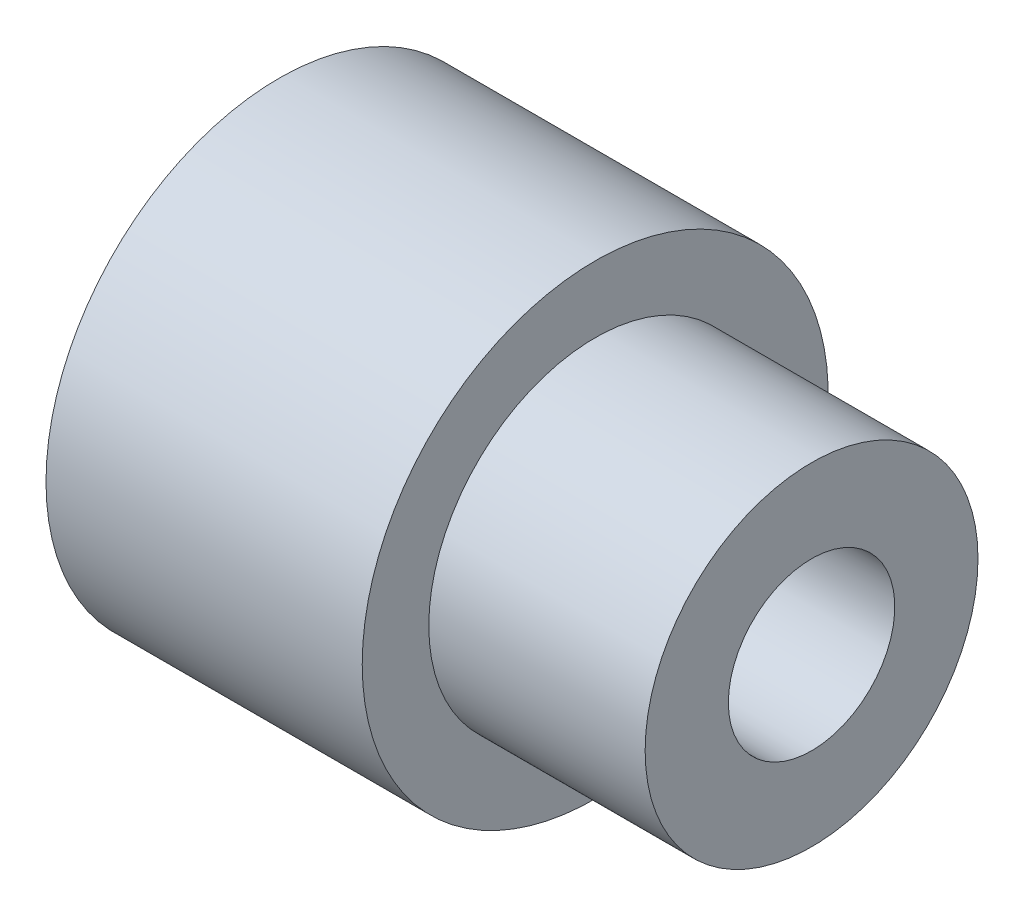
ISO-10303-21;
HEADER;
FILE_DESCRIPTION(('STEP AP214'),'2;1');
FILE_NAME('part.step','',(''),(''),'','','');
FILE_SCHEMA(('AUTOMOTIVE_DESIGN { 1 0 10303 214 1 1 1 1 }'));
ENDSEC;
DATA;
#1=APPLICATION_CONTEXT('core data for automotive mechanical design processes');
#2=APPLICATION_PROTOCOL_DEFINITION('international standard','automotive_design',2000,#1);
#3=PRODUCT_CONTEXT('',#1,'mechanical');
#4=PRODUCT('Part','Part','',(#3));
#5=PRODUCT_RELATED_PRODUCT_CATEGORY('part','',(#4));
#6=PRODUCT_DEFINITION_FORMATION('','',#4);
#7=PRODUCT_DEFINITION_CONTEXT('part definition',#1,'design');
#8=PRODUCT_DEFINITION('design','',#6,#7);
#9=PRODUCT_DEFINITION_SHAPE('','',#8);
#10=(LENGTH_UNIT() NAMED_UNIT(*) SI_UNIT(.MILLI.,.METRE.));
#11=(NAMED_UNIT(*) PLANE_ANGLE_UNIT() SI_UNIT($,.RADIAN.));
#12=(NAMED_UNIT(*) SI_UNIT($,.STERADIAN.) SOLID_ANGLE_UNIT());
#13=UNCERTAINTY_MEASURE_WITH_UNIT(LENGTH_MEASURE(1.E-05),#10,'distance_accuracy_value','');
#14=(GEOMETRIC_REPRESENTATION_CONTEXT(3) GLOBAL_UNCERTAINTY_ASSIGNED_CONTEXT((#13)) GLOBAL_UNIT_ASSIGNED_CONTEXT((#10,
#11,#12)) REPRESENTATION_CONTEXT('',''));
#15=CARTESIAN_POINT('',(0.,0.,0.));
#16=DIRECTION('',(0.,0.,1.));
#17=DIRECTION('',(1.,0.,0.));
#18=AXIS2_PLACEMENT_3D('',#15,#16,#17);
#19=CARTESIAN_POINT('',(-24.6125870642381,0.,0.));
#20=DIRECTION('',(-1.,0.,0.));
#21=DIRECTION('',(0.,0.,1.));
#22=AXIS2_PLACEMENT_3D('',#19,#20,#21);
#23=CYLINDRICAL_SURFACE('',#22,11.);
#24=CARTESIAN_POINT('',(-10.,0.,0.));
#25=DIRECTION('',(-1.,0.,0.));
#26=DIRECTION('',(0.,0.,1.));
#27=AXIS2_PLACEMENT_3D('',#24,#25,#26);
#28=CIRCLE('',#27,11.);
#29=CARTESIAN_POINT('',(-10.,0.,11.));
#30=VERTEX_POINT('',#29);
#31=EDGE_CURVE('E83',#30,#30,#28,.T.);
#32=ORIENTED_EDGE('',*,*,#31,.F.);
#33=EDGE_LOOP('',(#32));
#34=FACE_BOUND('',#33,.T.);
#35=CARTESIAN_POINT('',(-16.,0.,0.));
#36=DIRECTION('',(-1.,0.,0.));
#37=DIRECTION('',(0.,0.,1.));
#38=AXIS2_PLACEMENT_3D('',#35,#36,#37);
#39=CIRCLE('',#38,11.);
#40=CARTESIAN_POINT('',(-16.,0.,11.));
#41=VERTEX_POINT('',#40);
#42=EDGE_CURVE('E10',#41,#41,#39,.T.);
#43=ORIENTED_EDGE('',*,*,#42,.T.);
#44=EDGE_LOOP('',(#43));
#45=FACE_BOUND('',#44,.T.);
#46=ADVANCED_FACE('F40',(#34,#45),#23,.F.);
#47=CARTESIAN_POINT('',(-16.,11.,0.));
#48=DIRECTION('',(1.,0.,0.));
#49=DIRECTION('',(0.,0.,-1.));
#50=AXIS2_PLACEMENT_3D('',#47,#48,#49);
#51=PLANE('',#50);
#52=ORIENTED_EDGE('',*,*,#42,.F.);
#53=EDGE_LOOP('',(#52));
#54=FACE_BOUND('',#53,.T.);
#55=CARTESIAN_POINT('',(-16.,0.,0.));
#56=DIRECTION('',(-1.,0.,0.));
#57=DIRECTION('',(0.,0.,1.));
#58=AXIS2_PLACEMENT_3D('',#55,#56,#57);
#59=CIRCLE('',#58,14.);
#60=CARTESIAN_POINT('',(-16.,0.,14.));
#61=VERTEX_POINT('',#60);
#62=EDGE_CURVE('E47',#61,#61,#59,.T.);
#63=ORIENTED_EDGE('',*,*,#62,.T.);
#64=EDGE_LOOP('',(#63));
#65=FACE_BOUND('',#64,.T.);
#66=ADVANCED_FACE('F91',(#54,#65),#51,.F.);
#67=CARTESIAN_POINT('',(-24.6125870642381,0.,0.));
#68=DIRECTION('',(-1.,0.,0.));
#69=DIRECTION('',(0.,0.,1.));
#70=AXIS2_PLACEMENT_3D('',#67,#68,#69);
#71=CYLINDRICAL_SURFACE('',#70,14.);
#72=ORIENTED_EDGE('',*,*,#62,.F.);
#73=EDGE_LOOP('',(#72));
#74=FACE_BOUND('',#73,.T.);
#75=CARTESIAN_POINT('',(3.,0.,0.));
#76=DIRECTION('',(-1.,0.,0.));
#77=DIRECTION('',(0.,0.,1.));
#78=AXIS2_PLACEMENT_3D('',#75,#76,#77);
#79=CIRCLE('',#78,14.);
#80=CARTESIAN_POINT('',(3.,0.,14.));
#81=VERTEX_POINT('',#80);
#82=EDGE_CURVE('E52',#81,#81,#79,.T.);
#83=ORIENTED_EDGE('',*,*,#82,.T.);
#84=EDGE_LOOP('',(#83));
#85=FACE_BOUND('',#84,.T.);
#86=ADVANCED_FACE('F95',(#74,#85),#71,.T.);
#87=CARTESIAN_POINT('',(3.,14.,0.));
#88=DIRECTION('',(-1.,0.,0.));
#89=DIRECTION('',(0.,0.,1.));
#90=AXIS2_PLACEMENT_3D('',#87,#88,#89);
#91=PLANE('',#90);
#92=ORIENTED_EDGE('',*,*,#82,.F.);
#93=EDGE_LOOP('',(#92));
#94=FACE_BOUND('',#93,.T.);
#95=CARTESIAN_POINT('',(3.,0.,0.));
#96=DIRECTION('',(-1.,0.,0.));
#97=DIRECTION('',(0.,0.,1.));
#98=AXIS2_PLACEMENT_3D('',#95,#96,#97);
#99=CIRCLE('',#98,10.);
#100=CARTESIAN_POINT('',(3.,0.,10.));
#101=VERTEX_POINT('',#100);
#102=EDGE_CURVE('E57',#101,#101,#99,.T.);
#103=ORIENTED_EDGE('',*,*,#102,.T.);
#104=EDGE_LOOP('',(#103));
#105=FACE_BOUND('',#104,.T.);
#106=ADVANCED_FACE('F100',(#94,#105),#91,.F.);
#107=CARTESIAN_POINT('',(-24.6125870642381,0.,0.));
#108=DIRECTION('',(-1.,0.,0.));
#109=DIRECTION('',(0.,0.,1.));
#110=AXIS2_PLACEMENT_3D('',#107,#108,#109);
#111=CYLINDRICAL_SURFACE('',#110,10.);
#112=ORIENTED_EDGE('',*,*,#102,.F.);
#113=EDGE_LOOP('',(#112));
#114=FACE_BOUND('',#113,.T.);
#115=CARTESIAN_POINT('',(16.,0.,0.));
#116=DIRECTION('',(-1.,0.,0.));
#117=DIRECTION('',(0.,0.,1.));
#118=AXIS2_PLACEMENT_3D('',#115,#116,#117);
#119=CIRCLE('',#118,10.);
#120=CARTESIAN_POINT('',(16.,0.,10.));
#121=VERTEX_POINT('',#120);
#122=EDGE_CURVE('E63',#121,#121,#119,.T.);
#123=ORIENTED_EDGE('',*,*,#122,.T.);
#124=EDGE_LOOP('',(#123));
#125=FACE_BOUND('',#124,.T.);
#126=ADVANCED_FACE('F106',(#114,#125),#111,.T.);
#127=CARTESIAN_POINT('',(16.,10.,0.));
#128=DIRECTION('',(-1.,0.,0.));
#129=DIRECTION('',(0.,0.,1.));
#130=AXIS2_PLACEMENT_3D('',#127,#128,#129);
#131=PLANE('',#130);
#132=ORIENTED_EDGE('',*,*,#122,.F.);
#133=EDGE_LOOP('',(#132));
#134=FACE_BOUND('',#133,.T.);
#135=CARTESIAN_POINT('',(16.,0.,0.));
#136=DIRECTION('',(-1.,0.,0.));
#137=DIRECTION('',(0.,0.,1.));
#138=AXIS2_PLACEMENT_3D('',#135,#136,#137);
#139=CIRCLE('',#138,5.);
#140=CARTESIAN_POINT('',(16.,0.,5.));
#141=VERTEX_POINT('',#140);
#142=EDGE_CURVE('E67',#141,#141,#139,.T.);
#143=ORIENTED_EDGE('',*,*,#142,.T.);
#144=EDGE_LOOP('',(#143));
#145=FACE_BOUND('',#144,.T.);
#146=ADVANCED_FACE('F110',(#134,#145),#131,.F.);
#147=CARTESIAN_POINT('',(-24.6125870642381,0.,0.));
#148=DIRECTION('',(-1.,0.,0.));
#149=DIRECTION('',(0.,0.,1.));
#150=AXIS2_PLACEMENT_3D('',#147,#148,#149);
#151=CYLINDRICAL_SURFACE('',#150,5.);
#152=ORIENTED_EDGE('',*,*,#142,.F.);
#153=EDGE_LOOP('',(#152));
#154=FACE_BOUND('',#153,.T.);
#155=CARTESIAN_POINT('',(0.,0.,0.));
#156=DIRECTION('',(-1.,0.,0.));
#157=DIRECTION('',(0.,0.,1.));
#158=AXIS2_PLACEMENT_3D('',#155,#156,#157);
#159=CIRCLE('',#158,5.);
#160=CARTESIAN_POINT('',(0.,0.,5.));
#161=VERTEX_POINT('',#160);
#162=EDGE_CURVE('E71',#161,#161,#159,.T.);
#163=ORIENTED_EDGE('',*,*,#162,.T.);
#164=EDGE_LOOP('',(#163));
#165=FACE_BOUND('',#164,.T.);
#166=ADVANCED_FACE('F114',(#154,#165),#151,.F.);
#167=CARTESIAN_POINT('',(0.,5.,0.));
#168=DIRECTION('',(1.,0.,0.));
#169=DIRECTION('',(0.,0.,-1.));
#170=AXIS2_PLACEMENT_3D('',#167,#168,#169);
#171=PLANE('',#170);
#172=ORIENTED_EDGE('',*,*,#162,.F.);
#173=EDGE_LOOP('',(#172));
#174=FACE_BOUND('',#173,.T.);
#175=CARTESIAN_POINT('',(0.,0.,0.));
#176=DIRECTION('',(-1.,0.,0.));
#177=DIRECTION('',(0.,0.,1.));
#178=AXIS2_PLACEMENT_3D('',#175,#176,#177);
#179=CIRCLE('',#178,9.);
#180=CARTESIAN_POINT('',(0.,0.,9.));
#181=VERTEX_POINT('',#180);
#182=EDGE_CURVE('E75',#181,#181,#179,.T.);
#183=ORIENTED_EDGE('',*,*,#182,.T.);
#184=EDGE_LOOP('',(#183));
#185=FACE_BOUND('',#184,.T.);
#186=ADVANCED_FACE('F118',(#174,#185),#171,.F.);
#187=CARTESIAN_POINT('',(-24.6125870642381,0.,0.));
#188=DIRECTION('',(-1.,0.,0.));
#189=DIRECTION('',(0.,0.,1.));
#190=AXIS2_PLACEMENT_3D('',#187,#188,#189);
#191=CYLINDRICAL_SURFACE('',#190,9.);
#192=ORIENTED_EDGE('',*,*,#182,.F.);
#193=EDGE_LOOP('',(#192));
#194=FACE_BOUND('',#193,.T.);
#195=CARTESIAN_POINT('',(-10.,0.,0.));
#196=DIRECTION('',(-1.,0.,0.));
#197=DIRECTION('',(0.,0.,1.));
#198=AXIS2_PLACEMENT_3D('',#195,#196,#197);
#199=CIRCLE('',#198,9.);
#200=CARTESIAN_POINT('',(-10.,0.,9.));
#201=VERTEX_POINT('',#200);
#202=EDGE_CURVE('E79',#201,#201,#199,.T.);
#203=ORIENTED_EDGE('',*,*,#202,.T.);
#204=EDGE_LOOP('',(#203));
#205=FACE_BOUND('',#204,.T.);
#206=ADVANCED_FACE('F122',(#194,#205),#191,.F.);
#207=CARTESIAN_POINT('',(-10.,9.,0.));
#208=DIRECTION('',(1.,0.,0.));
#209=DIRECTION('',(0.,0.,-1.));
#210=AXIS2_PLACEMENT_3D('',#207,#208,#209);
#211=PLANE('',#210);
#212=ORIENTED_EDGE('',*,*,#202,.F.);
#213=EDGE_LOOP('',(#212));
#214=FACE_BOUND('',#213,.T.);
#215=ORIENTED_EDGE('',*,*,#31,.T.);
#216=EDGE_LOOP('',(#215));
#217=FACE_BOUND('',#216,.T.);
#218=ADVANCED_FACE('F88',(#214,#217),#211,.F.);
#219=CLOSED_SHELL('',(#46,#66,#86,#106,#126,#146,#166,#186,#206,#218));
#220=MANIFOLD_SOLID_BREP('B2',#219);
#221=ADVANCED_BREP_SHAPE_REPRESENTATION('',(#18,#220),#14);
#222=SHAPE_DEFINITION_REPRESENTATION(#9,#221);
ENDSEC;
END-ISO-10303-21;
